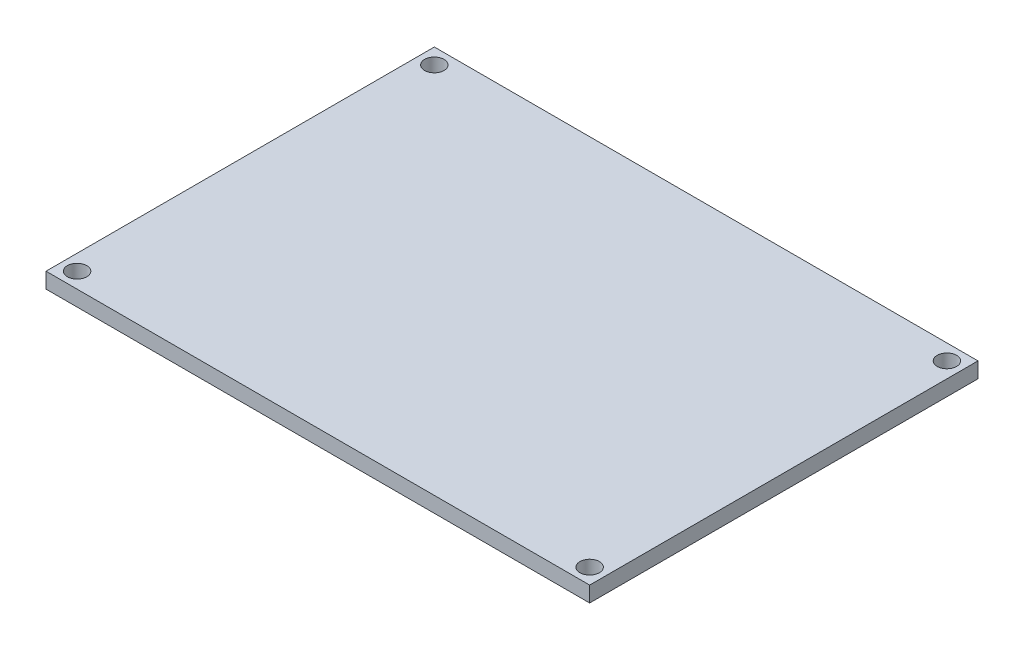
ISO-10303-21;
HEADER;
FILE_DESCRIPTION(('STEP AP214'),'2;1');
FILE_NAME('part.step','',(''),(''),'','','');
FILE_SCHEMA(('AUTOMOTIVE_DESIGN { 1 0 10303 214 1 1 1 1 }'));
ENDSEC;
DATA;
#1=APPLICATION_CONTEXT('core data for automotive mechanical design processes');
#2=APPLICATION_PROTOCOL_DEFINITION('international standard','automotive_design',2000,#1);
#3=PRODUCT_CONTEXT('',#1,'mechanical');
#4=PRODUCT('Part','Part','',(#3));
#5=PRODUCT_RELATED_PRODUCT_CATEGORY('part','',(#4));
#6=PRODUCT_DEFINITION_FORMATION('','',#4);
#7=PRODUCT_DEFINITION_CONTEXT('part definition',#1,'design');
#8=PRODUCT_DEFINITION('design','',#6,#7);
#9=PRODUCT_DEFINITION_SHAPE('','',#8);
#10=(LENGTH_UNIT() NAMED_UNIT(*) SI_UNIT(.MILLI.,.METRE.));
#11=(NAMED_UNIT(*) PLANE_ANGLE_UNIT() SI_UNIT($,.RADIAN.));
#12=(NAMED_UNIT(*) SI_UNIT($,.STERADIAN.) SOLID_ANGLE_UNIT());
#13=UNCERTAINTY_MEASURE_WITH_UNIT(LENGTH_MEASURE(1.E-05),#10,'distance_accuracy_value','');
#14=(GEOMETRIC_REPRESENTATION_CONTEXT(3) GLOBAL_UNCERTAINTY_ASSIGNED_CONTEXT((#13)) GLOBAL_UNIT_ASSIGNED_CONTEXT((#10,
#11,#12)) REPRESENTATION_CONTEXT('',''));
#15=CARTESIAN_POINT('',(0.,0.,0.));
#16=DIRECTION('',(0.,0.,1.));
#17=DIRECTION('',(1.,0.,0.));
#18=AXIS2_PLACEMENT_3D('',#15,#16,#17);
#19=CARTESIAN_POINT('',(35.,2.,-25.));
#20=DIRECTION('',(-1.,0.,0.));
#21=DIRECTION('',(0.,0.,1.));
#22=AXIS2_PLACEMENT_3D('',#19,#20,#21);
#23=PLANE('',#22);
#24=DIRECTION('',(0.,0.,-1.));
#25=VECTOR('',#24,1.);
#26=CARTESIAN_POINT('',(35.,0.,-25.));
#27=LINE('',#26,#25);
#28=CARTESIAN_POINT('',(35.,0.,25.));
#29=VERTEX_POINT('',#28);
#30=CARTESIAN_POINT('',(35.,0.,-25.));
#31=VERTEX_POINT('',#30);
#32=EDGE_CURVE('E98',#29,#31,#27,.T.);
#33=ORIENTED_EDGE('',*,*,#32,.T.);
#34=DIRECTION('',(0.,-1.,0.));
#35=VECTOR('',#34,1.);
#36=CARTESIAN_POINT('',(35.,2.,-25.));
#37=LINE('',#36,#35);
#38=CARTESIAN_POINT('',(35.,2.,-25.));
#39=VERTEX_POINT('',#38);
#40=EDGE_CURVE('E11',#39,#31,#37,.T.);
#41=ORIENTED_EDGE('',*,*,#40,.F.);
#42=DIRECTION('',(0.,0.,-1.));
#43=VECTOR('',#42,1.);
#44=CARTESIAN_POINT('',(35.,2.,-25.));
#45=LINE('',#44,#43);
#46=CARTESIAN_POINT('',(35.,2.,25.));
#47=VERTEX_POINT('',#46);
#48=EDGE_CURVE('E85',#47,#39,#45,.T.);
#49=ORIENTED_EDGE('',*,*,#48,.F.);
#50=DIRECTION('',(0.,-1.,0.));
#51=VECTOR('',#50,1.);
#52=CARTESIAN_POINT('',(35.,2.,25.));
#53=LINE('',#52,#51);
#54=EDGE_CURVE('E94',#47,#29,#53,.T.);
#55=ORIENTED_EDGE('',*,*,#54,.T.);
#56=EDGE_LOOP('',(#33,#41,#49,#55));
#57=FACE_BOUND('',#56,.T.);
#58=ADVANCED_FACE('F32',(#57),#23,.F.);
#59=CARTESIAN_POINT('',(-35.,2.,-25.));
#60=DIRECTION('',(0.,0.,1.));
#61=DIRECTION('',(1.,0.,0.));
#62=AXIS2_PLACEMENT_3D('',#59,#60,#61);
#63=PLANE('',#62);
#64=DIRECTION('',(-1.,0.,0.));
#65=VECTOR('',#64,1.);
#66=CARTESIAN_POINT('',(-35.,0.,-25.));
#67=LINE('',#66,#65);
#68=CARTESIAN_POINT('',(-35.,0.,-25.));
#69=VERTEX_POINT('',#68);
#70=EDGE_CURVE('E89',#31,#69,#67,.T.);
#71=ORIENTED_EDGE('',*,*,#70,.T.);
#72=DIRECTION('',(0.,-1.,0.));
#73=VECTOR('',#72,1.);
#74=CARTESIAN_POINT('',(-35.,2.,-25.));
#75=LINE('',#74,#73);
#76=CARTESIAN_POINT('',(-35.,2.,-25.));
#77=VERTEX_POINT('',#76);
#78=EDGE_CURVE('E41',#77,#69,#75,.T.);
#79=ORIENTED_EDGE('',*,*,#78,.F.);
#80=DIRECTION('',(-1.,0.,0.));
#81=VECTOR('',#80,1.);
#82=CARTESIAN_POINT('',(-35.,2.,-25.));
#83=LINE('',#82,#81);
#84=EDGE_CURVE('E80',#39,#77,#83,.T.);
#85=ORIENTED_EDGE('',*,*,#84,.F.);
#86=ORIENTED_EDGE('',*,*,#40,.T.);
#87=EDGE_LOOP('',(#71,#79,#85,#86));
#88=FACE_BOUND('',#87,.T.);
#89=ADVANCED_FACE('F88',(#88),#63,.F.);
#90=CARTESIAN_POINT('',(-35.,2.,-25.));
#91=DIRECTION('',(1.,0.,0.));
#92=DIRECTION('',(0.,0.,-1.));
#93=AXIS2_PLACEMENT_3D('',#90,#91,#92);
#94=PLANE('',#93);
#95=DIRECTION('',(0.,0.,1.));
#96=VECTOR('',#95,1.);
#97=CARTESIAN_POINT('',(-35.,0.,-25.));
#98=LINE('',#97,#96);
#99=CARTESIAN_POINT('',(-35.,0.,25.));
#100=VERTEX_POINT('',#99);
#101=EDGE_CURVE('E67',#69,#100,#98,.T.);
#102=ORIENTED_EDGE('',*,*,#101,.T.);
#103=DIRECTION('',(0.,-1.,0.));
#104=VECTOR('',#103,1.);
#105=CARTESIAN_POINT('',(-35.,2.,25.));
#106=LINE('',#105,#104);
#107=CARTESIAN_POINT('',(-35.,2.,25.));
#108=VERTEX_POINT('',#107);
#109=EDGE_CURVE('E90',#108,#100,#106,.T.);
#110=ORIENTED_EDGE('',*,*,#109,.F.);
#111=DIRECTION('',(0.,0.,1.));
#112=VECTOR('',#111,1.);
#113=CARTESIAN_POINT('',(-35.,2.,-25.));
#114=LINE('',#113,#112);
#115=EDGE_CURVE('E83',#77,#108,#114,.T.);
#116=ORIENTED_EDGE('',*,*,#115,.F.);
#117=ORIENTED_EDGE('',*,*,#78,.T.);
#118=EDGE_LOOP('',(#102,#110,#116,#117));
#119=FACE_BOUND('',#118,.T.);
#120=ADVANCED_FACE('F92',(#119),#94,.F.);
#121=CARTESIAN_POINT('',(-35.,2.,25.));
#122=DIRECTION('',(0.,0.,-1.));
#123=DIRECTION('',(-1.,0.,0.));
#124=AXIS2_PLACEMENT_3D('',#121,#122,#123);
#125=PLANE('',#124);
#126=DIRECTION('',(1.,0.,0.));
#127=VECTOR('',#126,1.);
#128=CARTESIAN_POINT('',(-35.,0.,25.));
#129=LINE('',#128,#127);
#130=EDGE_CURVE('E73',#100,#29,#129,.T.);
#131=ORIENTED_EDGE('',*,*,#130,.T.);
#132=ORIENTED_EDGE('',*,*,#54,.F.);
#133=DIRECTION('',(1.,0.,0.));
#134=VECTOR('',#133,1.);
#135=CARTESIAN_POINT('',(-35.,2.,25.));
#136=LINE('',#135,#134);
#137=EDGE_CURVE('E50',#108,#47,#136,.T.);
#138=ORIENTED_EDGE('',*,*,#137,.F.);
#139=ORIENTED_EDGE('',*,*,#109,.T.);
#140=EDGE_LOOP('',(#131,#132,#138,#139));
#141=FACE_BOUND('',#140,.T.);
#142=ADVANCED_FACE('F150',(#141),#125,.F.);
#143=CARTESIAN_POINT('',(0.,2.,0.));
#144=DIRECTION('',(0.,1.,0.));
#145=DIRECTION('',(0.,0.,1.));
#146=AXIS2_PLACEMENT_3D('',#143,#144,#145);
#147=PLANE('',#146);
#148=CARTESIAN_POINT('',(-33.,2.,-23.));
#149=DIRECTION('',(0.,-1.,0.));
#150=DIRECTION('',(0.,0.,-1.));
#151=AXIS2_PLACEMENT_3D('',#148,#149,#150);
#152=CIRCLE('',#151,1.25);
#153=CARTESIAN_POINT('',(-33.,2.,-24.25));
#154=VERTEX_POINT('',#153);
#155=EDGE_CURVE('E216',#154,#154,#152,.T.);
#156=ORIENTED_EDGE('',*,*,#155,.T.);
#157=EDGE_LOOP('',(#156));
#158=FACE_BOUND('',#157,.T.);
#159=CARTESIAN_POINT('',(33.,2.,-23.));
#160=DIRECTION('',(0.,-1.,0.));
#161=DIRECTION('',(0.,0.,-1.));
#162=AXIS2_PLACEMENT_3D('',#159,#160,#161);
#163=CIRCLE('',#162,1.25);
#164=CARTESIAN_POINT('',(33.,2.,-24.25));
#165=VERTEX_POINT('',#164);
#166=EDGE_CURVE('E211',#165,#165,#163,.T.);
#167=ORIENTED_EDGE('',*,*,#166,.T.);
#168=EDGE_LOOP('',(#167));
#169=FACE_BOUND('',#168,.T.);
#170=CARTESIAN_POINT('',(33.,2.,23.));
#171=DIRECTION('',(0.,-1.,0.));
#172=DIRECTION('',(0.,0.,-1.));
#173=AXIS2_PLACEMENT_3D('',#170,#171,#172);
#174=CIRCLE('',#173,1.25);
#175=CARTESIAN_POINT('',(33.,2.,21.75));
#176=VERTEX_POINT('',#175);
#177=EDGE_CURVE('E204',#176,#176,#174,.T.);
#178=ORIENTED_EDGE('',*,*,#177,.T.);
#179=EDGE_LOOP('',(#178));
#180=FACE_BOUND('',#179,.T.);
#181=CARTESIAN_POINT('',(-33.,2.,23.));
#182=DIRECTION('',(0.,-1.,0.));
#183=DIRECTION('',(0.,0.,-1.));
#184=AXIS2_PLACEMENT_3D('',#181,#182,#183);
#185=CIRCLE('',#184,1.25);
#186=CARTESIAN_POINT('',(-33.,2.,21.75));
#187=VERTEX_POINT('',#186);
#188=EDGE_CURVE('E110',#187,#187,#185,.T.);
#189=ORIENTED_EDGE('',*,*,#188,.T.);
#190=EDGE_LOOP('',(#189));
#191=FACE_BOUND('',#190,.T.);
#192=ORIENTED_EDGE('',*,*,#48,.T.);
#193=ORIENTED_EDGE('',*,*,#84,.T.);
#194=ORIENTED_EDGE('',*,*,#115,.T.);
#195=ORIENTED_EDGE('',*,*,#137,.T.);
#196=EDGE_LOOP('',(#192,#193,#194,#195));
#197=FACE_BOUND('',#196,.T.);
#198=ADVANCED_FACE('F81',(#158,#169,#180,#191,#197),#147,.T.);
#199=CARTESIAN_POINT('',(0.,0.,0.));
#200=DIRECTION('',(0.,1.,0.));
#201=DIRECTION('',(0.,0.,1.));
#202=AXIS2_PLACEMENT_3D('',#199,#200,#201);
#203=PLANE('',#202);
#204=CARTESIAN_POINT('',(-33.,0.,-23.));
#205=DIRECTION('',(0.,1.,0.));
#206=DIRECTION('',(0.,0.,1.));
#207=AXIS2_PLACEMENT_3D('',#204,#205,#206);
#208=CIRCLE('',#207,1.25);
#209=CARTESIAN_POINT('',(-33.,0.,-21.75));
#210=VERTEX_POINT('',#209);
#211=EDGE_CURVE('E35',#210,#210,#208,.T.);
#212=ORIENTED_EDGE('',*,*,#211,.T.);
#213=EDGE_LOOP('',(#212));
#214=FACE_BOUND('',#213,.T.);
#215=CARTESIAN_POINT('',(33.,0.,-23.));
#216=DIRECTION('',(0.,1.,0.));
#217=DIRECTION('',(0.,0.,1.));
#218=AXIS2_PLACEMENT_3D('',#215,#216,#217);
#219=CIRCLE('',#218,1.25);
#220=CARTESIAN_POINT('',(33.,0.,-21.75));
#221=VERTEX_POINT('',#220);
#222=EDGE_CURVE('E112',#221,#221,#219,.T.);
#223=ORIENTED_EDGE('',*,*,#222,.T.);
#224=EDGE_LOOP('',(#223));
#225=FACE_BOUND('',#224,.T.);
#226=CARTESIAN_POINT('',(33.,0.,23.));
#227=DIRECTION('',(0.,1.,0.));
#228=DIRECTION('',(0.,0.,1.));
#229=AXIS2_PLACEMENT_3D('',#226,#227,#228);
#230=CIRCLE('',#229,1.25);
#231=CARTESIAN_POINT('',(33.,0.,24.25));
#232=VERTEX_POINT('',#231);
#233=EDGE_CURVE('E109',#232,#232,#230,.T.);
#234=ORIENTED_EDGE('',*,*,#233,.T.);
#235=EDGE_LOOP('',(#234));
#236=FACE_BOUND('',#235,.T.);
#237=CARTESIAN_POINT('',(-33.,0.,23.));
#238=DIRECTION('',(0.,1.,0.));
#239=DIRECTION('',(0.,0.,1.));
#240=AXIS2_PLACEMENT_3D('',#237,#238,#239);
#241=CIRCLE('',#240,1.25);
#242=CARTESIAN_POINT('',(-33.,0.,24.25));
#243=VERTEX_POINT('',#242);
#244=EDGE_CURVE('E106',#243,#243,#241,.T.);
#245=ORIENTED_EDGE('',*,*,#244,.T.);
#246=EDGE_LOOP('',(#245));
#247=FACE_BOUND('',#246,.T.);
#248=ORIENTED_EDGE('',*,*,#32,.F.);
#249=ORIENTED_EDGE('',*,*,#130,.F.);
#250=ORIENTED_EDGE('',*,*,#101,.F.);
#251=ORIENTED_EDGE('',*,*,#70,.F.);
#252=EDGE_LOOP('',(#248,#249,#250,#251));
#253=FACE_BOUND('',#252,.T.);
#254=ADVANCED_FACE('F119',(#214,#225,#236,#247,#253),#203,.F.);
#255=CARTESIAN_POINT('',(-33.,2.,23.));
#256=DIRECTION('',(0.,-1.,0.));
#257=DIRECTION('',(0.,0.,-1.));
#258=AXIS2_PLACEMENT_3D('',#255,#256,#257);
#259=CYLINDRICAL_SURFACE('',#258,1.25);
#260=ORIENTED_EDGE('',*,*,#188,.F.);
#261=EDGE_LOOP('',(#260));
#262=FACE_BOUND('',#261,.T.);
#263=ORIENTED_EDGE('',*,*,#244,.F.);
#264=EDGE_LOOP('',(#263));
#265=FACE_BOUND('',#264,.T.);
#266=ADVANCED_FACE('F142',(#262,#265),#259,.F.);
#267=CARTESIAN_POINT('',(33.,2.,23.));
#268=DIRECTION('',(0.,-1.,0.));
#269=DIRECTION('',(0.,0.,-1.));
#270=AXIS2_PLACEMENT_3D('',#267,#268,#269);
#271=CYLINDRICAL_SURFACE('',#270,1.25);
#272=ORIENTED_EDGE('',*,*,#177,.F.);
#273=EDGE_LOOP('',(#272));
#274=FACE_BOUND('',#273,.T.);
#275=ORIENTED_EDGE('',*,*,#233,.F.);
#276=EDGE_LOOP('',(#275));
#277=FACE_BOUND('',#276,.T.);
#278=ADVANCED_FACE('F129',(#274,#277),#271,.F.);
#279=CARTESIAN_POINT('',(33.,2.,-23.));
#280=DIRECTION('',(0.,-1.,0.));
#281=DIRECTION('',(0.,0.,-1.));
#282=AXIS2_PLACEMENT_3D('',#279,#280,#281);
#283=CYLINDRICAL_SURFACE('',#282,1.25);
#284=ORIENTED_EDGE('',*,*,#166,.F.);
#285=EDGE_LOOP('',(#284));
#286=FACE_BOUND('',#285,.T.);
#287=ORIENTED_EDGE('',*,*,#222,.F.);
#288=EDGE_LOOP('',(#287));
#289=FACE_BOUND('',#288,.T.);
#290=ADVANCED_FACE('F123',(#286,#289),#283,.F.);
#291=CARTESIAN_POINT('',(-33.,2.,-23.));
#292=DIRECTION('',(0.,-1.,0.));
#293=DIRECTION('',(0.,0.,-1.));
#294=AXIS2_PLACEMENT_3D('',#291,#292,#293);
#295=CYLINDRICAL_SURFACE('',#294,1.25);
#296=ORIENTED_EDGE('',*,*,#155,.F.);
#297=EDGE_LOOP('',(#296));
#298=FACE_BOUND('',#297,.T.);
#299=ORIENTED_EDGE('',*,*,#211,.F.);
#300=EDGE_LOOP('',(#299));
#301=FACE_BOUND('',#300,.T.);
#302=ADVANCED_FACE('F121',(#298,#301),#295,.F.);
#303=CLOSED_SHELL('',(#58,#89,#120,#142,#198,#254,#266,#278,#290,#302));
#304=MANIFOLD_SOLID_BREP('B2',#303);
#305=ADVANCED_BREP_SHAPE_REPRESENTATION('',(#18,#304),#14);
#306=SHAPE_DEFINITION_REPRESENTATION(#9,#305);
ENDSEC;
END-ISO-10303-21;
